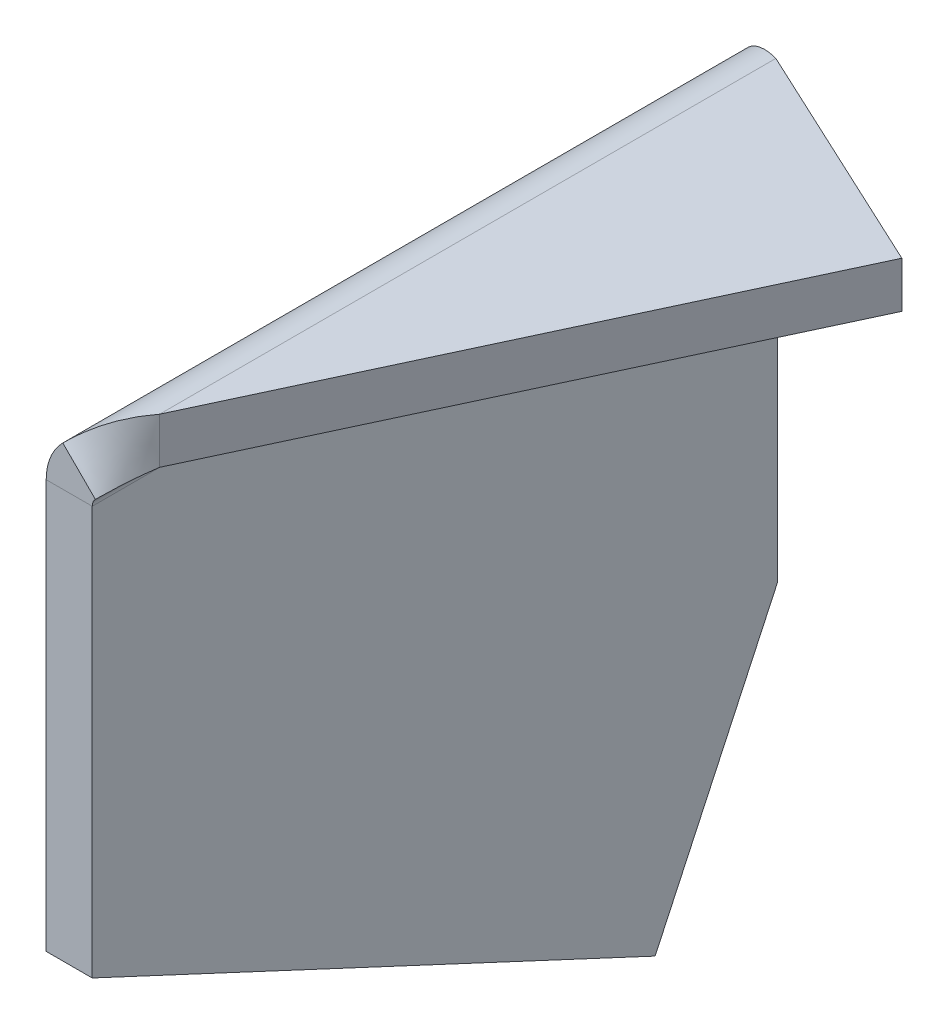
ISO-10303-21;
HEADER;
FILE_DESCRIPTION(('STEP AP214'),'2;1');
FILE_NAME('part.step','',(''),(''),'','','');
FILE_SCHEMA(('AUTOMOTIVE_DESIGN { 1 0 10303 214 1 1 1 1 }'));
ENDSEC;
DATA;
#1=APPLICATION_CONTEXT('core data for automotive mechanical design processes');
#2=APPLICATION_PROTOCOL_DEFINITION('international standard','automotive_design',2000,#1);
#3=PRODUCT_CONTEXT('',#1,'mechanical');
#4=PRODUCT('Part','Part','',(#3));
#5=PRODUCT_RELATED_PRODUCT_CATEGORY('part','',(#4));
#6=PRODUCT_DEFINITION_FORMATION('','',#4);
#7=PRODUCT_DEFINITION_CONTEXT('part definition',#1,'design');
#8=PRODUCT_DEFINITION('design','',#6,#7);
#9=PRODUCT_DEFINITION_SHAPE('','',#8);
#10=(LENGTH_UNIT() NAMED_UNIT(*) SI_UNIT(.MILLI.,.METRE.));
#11=(NAMED_UNIT(*) PLANE_ANGLE_UNIT() SI_UNIT($,.RADIAN.));
#12=(NAMED_UNIT(*) SI_UNIT($,.STERADIAN.) SOLID_ANGLE_UNIT());
#13=UNCERTAINTY_MEASURE_WITH_UNIT(LENGTH_MEASURE(1.E-05),#10,'distance_accuracy_value','');
#14=(GEOMETRIC_REPRESENTATION_CONTEXT(3) GLOBAL_UNCERTAINTY_ASSIGNED_CONTEXT((#13)) GLOBAL_UNIT_ASSIGNED_CONTEXT((#10,
#11,#12)) REPRESENTATION_CONTEXT('',''));
#15=CARTESIAN_POINT('',(0.,0.,0.));
#16=DIRECTION('',(0.,0.,1.));
#17=DIRECTION('',(1.,0.,0.));
#18=AXIS2_PLACEMENT_3D('',#15,#16,#17);
#19=CARTESIAN_POINT('',(31.0887438715521,-32.086256128448,0.));
#20=DIRECTION('',(-1.,0.,0.));
#21=DIRECTION('',(0.,0.,1.));
#22=AXIS2_PLACEMENT_3D('',#19,#20,#21);
#23=PLANE('',#22);
#24=DIRECTION('',(0.,-1.,0.));
#25=VECTOR('',#24,1.);
#26=CARTESIAN_POINT('',(31.088743871552,-2.08625612844799,0.));
#27=LINE('',#26,#25);
#28=CARTESIAN_POINT('',(31.088743871552,-3.9116,0.));
#29=VERTEX_POINT('',#28);
#30=CARTESIAN_POINT('',(31.0887438715521,-32.086256128448,0.));
#31=VERTEX_POINT('',#30);
#32=EDGE_CURVE('E61',#29,#31,#27,.T.);
#33=ORIENTED_EDGE('',*,*,#32,.F.);
#34=DIRECTION('',(0.,0.,1.));
#35=VECTOR('',#34,1.);
#36=CARTESIAN_POINT('',(31.088743871552,-3.9116,0.));
#37=LINE('',#36,#35);
#38=CARTESIAN_POINT('',(31.088743871552,-3.9116,47.26));
#39=VERTEX_POINT('',#38);
#40=EDGE_CURVE('E177',#29,#39,#37,.T.);
#41=ORIENTED_EDGE('',*,*,#40,.T.);
#42=DIRECTION('',(0.,1.,0.));
#43=VECTOR('',#42,1.);
#44=CARTESIAN_POINT('',(31.0887438715521,-32.086256128448,47.26));
#45=LINE('',#44,#43);
#46=CARTESIAN_POINT('',(31.0887438715521,-32.086256128448,47.26));
#47=VERTEX_POINT('',#46);
#48=EDGE_CURVE('E364',#47,#39,#45,.T.);
#49=ORIENTED_EDGE('',*,*,#48,.F.);
#50=DIRECTION('',(0.,0.4226182617407,0.90630778703665));
#51=VECTOR('',#50,1.);
#52=CARTESIAN_POINT('',(31.0887438715521,-32.086256128448,47.26));
#53=LINE('',#52,#51);
#54=CARTESIAN_POINT('',(31.0887438715522,-50.1878863193495,8.4409287831071));
#55=VERTEX_POINT('',#54);
#56=EDGE_CURVE('E362',#55,#47,#53,.T.);
#57=ORIENTED_EDGE('',*,*,#56,.F.);
#58=DIRECTION('',(0.,-0.90630778703665,0.4226182617407));
#59=VECTOR('',#58,1.);
#60=CARTESIAN_POINT('',(31.0887438715522,-50.1878863193495,8.4409287831071));
#61=LINE('',#60,#59);
#62=EDGE_CURVE('E359',#31,#55,#61,.T.);
#63=ORIENTED_EDGE('',*,*,#62,.F.);
#64=EDGE_LOOP('',(#33,#41,#49,#57,#63));
#65=FACE_BOUND('',#64,.T.);
#66=ADVANCED_FACE('F57',(#65),#23,.F.);
#67=CARTESIAN_POINT('',(31.0887438715522,-50.1878863193495,8.4409287831071));
#68=DIRECTION('',(0.,-0.4226182617407,-0.90630778703665));
#69=DIRECTION('',(0.,-0.90630778703665,0.4226182617407));
#70=AXIS2_PLACEMENT_3D('',#67,#68,#69);
#71=PLANE('',#70);
#72=DIRECTION('',(0.,-0.90630778703665,0.4226182617407));
#73=VECTOR('',#72,1.);
#74=CARTESIAN_POINT('',(27.9137438715522,-50.1878863193495,8.4409287831071));
#75=LINE('',#74,#73);
#76=CARTESIAN_POINT('',(27.9137438715521,-32.086256128448,0.));
#77=VERTEX_POINT('',#76);
#78=CARTESIAN_POINT('',(27.9137438715522,-50.1878863193495,8.4409287831071));
#79=VERTEX_POINT('',#78);
#80=EDGE_CURVE('E365',#77,#79,#75,.T.);
#81=ORIENTED_EDGE('',*,*,#80,.F.);
#82=DIRECTION('',(-1.,0.,0.));
#83=VECTOR('',#82,1.);
#84=CARTESIAN_POINT('',(31.0887438715521,-32.086256128448,0.));
#85=LINE('',#84,#83);
#86=EDGE_CURVE('E371',#31,#77,#85,.T.);
#87=ORIENTED_EDGE('',*,*,#86,.F.);
#88=ORIENTED_EDGE('',*,*,#62,.T.);
#89=DIRECTION('',(-1.,0.,0.));
#90=VECTOR('',#89,1.);
#91=CARTESIAN_POINT('',(31.0887438715522,-50.1878863193495,8.4409287831071));
#92=LINE('',#91,#90);
#93=EDGE_CURVE('E105',#55,#79,#92,.T.);
#94=ORIENTED_EDGE('',*,*,#93,.T.);
#95=EDGE_LOOP('',(#81,#87,#88,#94));
#96=FACE_BOUND('',#95,.T.);
#97=ADVANCED_FACE('F421',(#96),#71,.T.);
#98=CARTESIAN_POINT('',(31.088743871552,-2.08625612844799,0.));
#99=DIRECTION('',(0.,0.,-1.));
#100=DIRECTION('',(0.,-1.,0.));
#101=AXIS2_PLACEMENT_3D('',#98,#99,#100);
#102=PLANE('',#101);
#103=DIRECTION('',(-1.,0.,0.));
#104=VECTOR('',#103,1.);
#105=CARTESIAN_POINT('',(31.088743871552,-3.9116,0.));
#106=LINE('',#105,#104);
#107=CARTESIAN_POINT('',(27.913743871552,-3.91160000000001,0.));
#108=VERTEX_POINT('',#107);
#109=EDGE_CURVE('E377',#29,#108,#106,.T.);
#110=ORIENTED_EDGE('',*,*,#109,.F.);
#111=ORIENTED_EDGE('',*,*,#32,.T.);
#112=ORIENTED_EDGE('',*,*,#86,.T.);
#113=DIRECTION('',(0.,-1.,0.));
#114=VECTOR('',#113,1.);
#115=CARTESIAN_POINT('',(27.913743871552,-2.086256128448,0.));
#116=LINE('',#115,#114);
#117=EDGE_CURVE('E100',#108,#77,#116,.T.);
#118=ORIENTED_EDGE('',*,*,#117,.F.);
#119=EDGE_LOOP('',(#110,#111,#112,#118));
#120=FACE_BOUND('',#119,.T.);
#121=ADVANCED_FACE('F390',(#120),#102,.T.);
#122=CARTESIAN_POINT('',(31.0887438715521,-32.086256128448,47.26));
#123=DIRECTION('',(0.,0.,1.));
#124=DIRECTION('',(0.,1.,0.));
#125=AXIS2_PLACEMENT_3D('',#122,#123,#124);
#126=PLANE('',#125);
#127=DIRECTION('',(1.,0.,0.));
#128=VECTOR('',#127,1.);
#129=CARTESIAN_POINT('',(31.088743871552,-3.9116,47.26));
#130=LINE('',#129,#128);
#131=CARTESIAN_POINT('',(27.913743871552,-3.91160000000001,47.26));
#132=VERTEX_POINT('',#131);
#133=EDGE_CURVE('E12',#132,#39,#130,.T.);
#134=ORIENTED_EDGE('',*,*,#133,.F.);
#135=DIRECTION('',(0.,1.,0.));
#136=VECTOR('',#135,1.);
#137=CARTESIAN_POINT('',(27.9137438715521,-32.086256128448,47.26));
#138=LINE('',#137,#136);
#139=CARTESIAN_POINT('',(27.9137438715521,-32.086256128448,47.26));
#140=VERTEX_POINT('',#139);
#141=EDGE_CURVE('E370',#140,#132,#138,.T.);
#142=ORIENTED_EDGE('',*,*,#141,.F.);
#143=DIRECTION('',(-1.,0.,0.));
#144=VECTOR('',#143,1.);
#145=CARTESIAN_POINT('',(31.0887438715521,-32.086256128448,47.26));
#146=LINE('',#145,#144);
#147=EDGE_CURVE('E373',#47,#140,#146,.T.);
#148=ORIENTED_EDGE('',*,*,#147,.F.);
#149=ORIENTED_EDGE('',*,*,#48,.T.);
#150=EDGE_LOOP('',(#134,#142,#148,#149));
#151=FACE_BOUND('',#150,.T.);
#152=ADVANCED_FACE('F59',(#151),#126,.T.);
#153=CARTESIAN_POINT('',(31.0887438715521,-32.086256128448,47.26));
#154=DIRECTION('',(0.,-0.90630778703665,0.4226182617407));
#155=DIRECTION('',(0.,0.4226182617407,0.90630778703665));
#156=AXIS2_PLACEMENT_3D('',#153,#154,#155);
#157=PLANE('',#156);
#158=DIRECTION('',(0.,0.4226182617407,0.90630778703665));
#159=VECTOR('',#158,1.);
#160=CARTESIAN_POINT('',(27.9137438715521,-32.086256128448,47.26));
#161=LINE('',#160,#159);
#162=EDGE_CURVE('E367',#79,#140,#161,.T.);
#163=ORIENTED_EDGE('',*,*,#162,.F.);
#164=ORIENTED_EDGE('',*,*,#93,.F.);
#165=ORIENTED_EDGE('',*,*,#56,.T.);
#166=ORIENTED_EDGE('',*,*,#147,.T.);
#167=EDGE_LOOP('',(#163,#164,#165,#166));
#168=FACE_BOUND('',#167,.T.);
#169=ADVANCED_FACE('F345',(#168),#157,.T.);
#170=CARTESIAN_POINT('',(27.9137438715521,-32.086256128448,0.));
#171=DIRECTION('',(-1.,0.,0.));
#172=DIRECTION('',(0.,0.,1.));
#173=AXIS2_PLACEMENT_3D('',#170,#171,#172);
#174=PLANE('',#173);
#175=DIRECTION('',(0.,0.,1.));
#176=VECTOR('',#175,1.);
#177=CARTESIAN_POINT('',(27.913743871552,-3.91160000000001,0.));
#178=LINE('',#177,#176);
#179=EDGE_CURVE('E66',#108,#132,#178,.T.);
#180=ORIENTED_EDGE('',*,*,#179,.F.);
#181=ORIENTED_EDGE('',*,*,#117,.T.);
#182=ORIENTED_EDGE('',*,*,#80,.T.);
#183=ORIENTED_EDGE('',*,*,#162,.T.);
#184=ORIENTED_EDGE('',*,*,#141,.T.);
#185=EDGE_LOOP('',(#180,#181,#182,#183,#184));
#186=FACE_BOUND('',#185,.T.);
#187=ADVANCED_FACE('F385',(#186),#174,.T.);
#188=CARTESIAN_POINT('',(0.,-3.175,0.));
#189=DIRECTION('',(0.,1.,0.));
#190=DIRECTION('',(0.,0.,1.));
#191=AXIS2_PLACEMENT_3D('',#188,#189,#190);
#192=PLANE('',#191);
#193=DIRECTION('',(0.,0.,1.));
#194=VECTOR('',#193,1.);
#195=CARTESIAN_POINT('',(31.825343871552,-3.175,0.));
#196=LINE('',#195,#194);
#197=CARTESIAN_POINT('',(31.825343871552,-3.175,0.851171826071001));
#198=VERTEX_POINT('',#197);
#199=CARTESIAN_POINT('',(31.825343871552,-3.175,43.345537435147));
#200=VERTEX_POINT('',#199);
#201=EDGE_CURVE('E158',#198,#200,#196,.T.);
#202=ORIENTED_EDGE('',*,*,#201,.F.);
#203=DIRECTION('',(-0.90630778703665,0.,-0.4226182617407));
#204=VECTOR('',#203,1.);
#205=CARTESIAN_POINT('',(48.1016301909015,-3.175,8.4409287831071));
#206=LINE('',#205,#204);
#207=CARTESIAN_POINT('',(48.1016301909015,-3.175,8.4409287831071));
#208=VERTEX_POINT('',#207);
#209=EDGE_CURVE('E409',#208,#198,#206,.T.);
#210=ORIENTED_EDGE('',*,*,#209,.F.);
#211=DIRECTION('',(0.4226182617407,0.,-0.90630778703665));
#212=VECTOR('',#211,1.);
#213=CARTESIAN_POINT('',(30.,-3.175,47.26));
#214=LINE('',#213,#212);
#215=EDGE_CURVE('E297',#200,#208,#214,.T.);
#216=ORIENTED_EDGE('',*,*,#215,.F.);
#217=EDGE_LOOP('',(#202,#210,#216));
#218=FACE_BOUND('',#217,.T.);
#219=ADVANCED_FACE('F339',(#218),#192,.F.);
#220=CARTESIAN_POINT('',(48.1016301909015,-3.175,8.4409287831071));
#221=DIRECTION('',(0.4226182617407,0.,-0.90630778703665));
#222=DIRECTION('',(-0.90630778703665,0.,-0.4226182617407));
#223=AXIS2_PLACEMENT_3D('',#220,#221,#222);
#224=PLANE('',#223);
#225=ORIENTED_EDGE('',*,*,#209,.T.);
#226=CARTESIAN_POINT('',(31.825343871552,0.,0.851171826071001));
#227=CARTESIAN_POINT('',(31.825343871552,-3.175,0.851171826071001));
#228=B_SPLINE_CURVE_WITH_KNOTS('',1,(#226,#227),.UNSPECIFIED.,.F.,.F.,(2,2),(0.,1.),.UNSPECIFIED.);
#229=CARTESIAN_POINT('',(31.825343871552,0.,0.851171826070999));
#230=VERTEX_POINT('',#229);
#231=EDGE_CURVE('E167',#198,#230,#228,.F.);
#232=ORIENTED_EDGE('',*,*,#231,.T.);
#233=DIRECTION('',(-0.90630778703665,0.,-0.4226182617407));
#234=VECTOR('',#233,1.);
#235=CARTESIAN_POINT('',(48.1016301909015,0.,8.4409287831071));
#236=LINE('',#235,#234);
#237=CARTESIAN_POINT('',(48.1016301909015,0.,8.4409287831071));
#238=VERTEX_POINT('',#237);
#239=EDGE_CURVE('E311',#238,#230,#236,.T.);
#240=ORIENTED_EDGE('',*,*,#239,.F.);
#241=DIRECTION('',(0.,1.,0.));
#242=VECTOR('',#241,1.);
#243=CARTESIAN_POINT('',(48.1016301909015,-3.175,8.4409287831071));
#244=LINE('',#243,#242);
#245=EDGE_CURVE('E306',#208,#238,#244,.T.);
#246=ORIENTED_EDGE('',*,*,#245,.F.);
#247=EDGE_LOOP('',(#225,#232,#240,#246));
#248=FACE_BOUND('',#247,.T.);
#249=ADVANCED_FACE('F329',(#248),#224,.T.);
#250=CARTESIAN_POINT('',(0.,0.,0.));
#251=DIRECTION('',(0.,1.,0.));
#252=DIRECTION('',(0.,0.,1.));
#253=AXIS2_PLACEMENT_3D('',#250,#251,#252);
#254=PLANE('',#253);
#255=ORIENTED_EDGE('',*,*,#239,.T.);
#256=DIRECTION('',(0.,0.,1.));
#257=VECTOR('',#256,1.);
#258=CARTESIAN_POINT('',(31.825343871552,0.,0.));
#259=LINE('',#258,#257);
#260=CARTESIAN_POINT('',(31.825343871552,0.,43.345537435147));
#261=VERTEX_POINT('',#260);
#262=EDGE_CURVE('E300',#230,#261,#259,.T.);
#263=ORIENTED_EDGE('',*,*,#262,.T.);
#264=DIRECTION('',(0.4226182617407,0.,-0.90630778703665));
#265=VECTOR('',#264,1.);
#266=CARTESIAN_POINT('',(30.,0.,47.26));
#267=LINE('',#266,#265);
#268=EDGE_CURVE('E298',#261,#238,#267,.T.);
#269=ORIENTED_EDGE('',*,*,#268,.T.);
#270=EDGE_LOOP('',(#255,#263,#269));
#271=FACE_BOUND('',#270,.T.);
#272=ADVANCED_FACE('F310',(#271),#254,.T.);
#273=CARTESIAN_POINT('',(30.,-3.175,47.26));
#274=DIRECTION('',(0.90630778703665,0.,0.4226182617407));
#275=DIRECTION('',(0.4226182617407,0.,-0.90630778703665));
#276=AXIS2_PLACEMENT_3D('',#273,#274,#275);
#277=PLANE('',#276);
#278=ORIENTED_EDGE('',*,*,#268,.F.);
#279=CARTESIAN_POINT('',(31.825343871552,-3.175,43.345537435147));
#280=CARTESIAN_POINT('',(31.825343871552,0.,43.345537435147));
#281=B_SPLINE_CURVE_WITH_KNOTS('',1,(#279,#280),.UNSPECIFIED.,.F.,.F.,(2,2),(0.,1.),.UNSPECIFIED.);
#282=EDGE_CURVE('E278',#261,#200,#281,.F.);
#283=ORIENTED_EDGE('',*,*,#282,.T.);
#284=ORIENTED_EDGE('',*,*,#215,.T.);
#285=ORIENTED_EDGE('',*,*,#245,.T.);
#286=EDGE_LOOP('',(#278,#283,#284,#285));
#287=FACE_BOUND('',#286,.T.);
#288=ADVANCED_FACE('F304',(#287),#277,.T.);
#289=CARTESIAN_POINT('',(29.0594249862627,-1.14568111471071,0.));
#290=CARTESIAN_POINT('',(29.4215435461115,-0.783562554861925,0.141885724941602));
#291=CARTESIAN_POINT('',(29.8553878679332,-0.49369716331349,0.283723942023667));
#292=CARTESIAN_POINT('',(30.8014908470922,-0.101808477944218,0.567447884047334));
#293=CARTESIAN_POINT('',(31.3132308930268,0.,0.709286101129387));
#294=CARTESIAN_POINT('',(31.825343871552,0.,0.851171826071001));
#295=CARTESIAN_POINT('',(31.30448901653,-3.39074514497799,0.));
#296=CARTESIAN_POINT('',(31.3726726419507,-3.32256151955729,0.141870053163717));
#297=CARTESIAN_POINT('',(31.4543781306108,-3.26796894633825,0.283723942023667));
#298=CARTESIAN_POINT('',(31.632540379933,-3.19417172636612,0.567447884047334));
#299=CARTESIAN_POINT('',(31.7289176637503,-3.175,0.709301772907275));
#300=CARTESIAN_POINT('',(31.825343871552,-3.175,0.851171826071001));
#301=B_SPLINE_SURFACE_WITH_KNOTS('',1,3,((#289,#290,#291,#292,#293,#294),(#295,#296,#297,#298,
#299,#300)),.UNSPECIFIED.,.F.,.F.,.F.,(2,2),(4,2,4),(0.,1.),(0.,0.5,1.),.UNSPECIFIED.);
#302=CARTESIAN_POINT('',(31.30448901653,-3.39074514497799,0.));
#303=CARTESIAN_POINT('',(29.0594249862627,-1.14568111471071,0.));
#304=B_SPLINE_CURVE_WITH_KNOTS('',1,(#302,#303),.UNSPECIFIED.,.F.,.F.,(2,2),(0.,1.),.UNSPECIFIED.);
#305=CARTESIAN_POINT('',(29.0594249862627,-1.14568111471071,0.));
#306=VERTEX_POINT('',#305);
#307=CARTESIAN_POINT('',(31.30448901653,-3.39074514497799,0.));
#308=VERTEX_POINT('',#307);
#309=EDGE_CURVE('E147',#306,#308,#304,.F.);
#310=CARTESIAN_POINT('',(29.0594249862627,-1.14568111471071,0.));
#311=CARTESIAN_POINT('',(29.4215435461115,-0.783562554861925,0.141885724941602));
#312=CARTESIAN_POINT('',(29.8553878679332,-0.49369716331349,0.283723942023667));
#313=CARTESIAN_POINT('',(30.8014908470922,-0.101808477944218,0.567447884047334));
#314=CARTESIAN_POINT('',(31.3132308930268,0.,0.709286101129387));
#315=CARTESIAN_POINT('',(31.825343871552,0.,0.851171826071001));
#316=B_SPLINE_CURVE_WITH_KNOTS('',3,(#310,#311,#312,#313,#314,#315),.UNSPECIFIED.,.F.,.F.,(4,2,
4),(0.,0.5,1.),.UNSPECIFIED.);
#317=EDGE_CURVE('E187',#306,#230,#316,.T.);
#318=CARTESIAN_POINT('',(31.825343871552,-3.175,0.851171826071001));
#319=CARTESIAN_POINT('',(31.7289176637503,-3.175,0.709301772907275));
#320=CARTESIAN_POINT('',(31.632540379933,-3.19417172636612,0.567447884047334));
#321=CARTESIAN_POINT('',(31.4543781306108,-3.26796894633825,0.283723942023667));
#322=CARTESIAN_POINT('',(31.3726726419507,-3.32256151955729,0.141870053163717));
#323=CARTESIAN_POINT('',(31.30448901653,-3.39074514497799,0.));
#324=B_SPLINE_CURVE_WITH_KNOTS('',3,(#318,#319,#320,#321,#322,#323),.UNSPECIFIED.,.F.,.F.,(4,2,
4),(0.,0.5,1.),.UNSPECIFIED.);
#325=EDGE_CURVE('E163',#308,#198,#324,.F.);
#326=ORIENTED_EDGE('',*,*,#309,.F.);
#327=ORIENTED_EDGE('',*,*,#317,.T.);
#328=ORIENTED_EDGE('',*,*,#231,.F.);
#329=ORIENTED_EDGE('',*,*,#325,.F.);
#330=EDGE_LOOP('',(#326,#327,#328,#329));
#331=FACE_BOUND('',#330,.T.);
#332=ADVANCED_FACE('F165',(#331),#301,.F.);
#333=CARTESIAN_POINT('',(31.825343871552,0.,43.345537435147));
#334=CARTESIAN_POINT('',(31.3132814405293,0.,43.9979926986282));
#335=CARTESIAN_POINT('',(30.8014908470922,-0.101808477944218,44.650358290098));
#336=CARTESIAN_POINT('',(29.8553878679332,-0.493697163313491,45.955179145049));
#337=CARTESIAN_POINT('',(29.4215078036297,-0.783598297343675,46.6075447365189));
#338=CARTESIAN_POINT('',(29.0594249862627,-1.14568111471071,47.26));
#339=CARTESIAN_POINT('',(31.825343871552,-3.175,43.345537435147));
#340=CARTESIAN_POINT('',(31.7289227854266,-3.175,43.9979503769687));
#341=CARTESIAN_POINT('',(31.632540379933,-3.19417172636612,44.650358290098));
#342=CARTESIAN_POINT('',(31.4543781306108,-3.26796894633825,45.955179145049));
#343=CARTESIAN_POINT('',(31.3726690203787,-3.32256514112933,46.6075870581783));
#344=CARTESIAN_POINT('',(31.30448901653,-3.39074514497799,47.26));
#345=B_SPLINE_SURFACE_WITH_KNOTS('',1,3,((#333,#334,#335,#336,#337,#338),(#339,#340,#341,#342,
#343,#344)),.UNSPECIFIED.,.F.,.F.,.F.,(2,2),(4,2,4),(0.,1.),(0.,0.5,1.),.UNSPECIFIED.);
#346=CARTESIAN_POINT('',(31.825343871552,0.,43.345537435147));
#347=CARTESIAN_POINT('',(31.3132814405293,0.,43.9979926986282));
#348=CARTESIAN_POINT('',(30.8014908470922,-0.101808477944218,44.650358290098));
#349=CARTESIAN_POINT('',(29.8553878679332,-0.493697163313491,45.955179145049));
#350=CARTESIAN_POINT('',(29.4215078036297,-0.783598297343675,46.6075447365189));
#351=CARTESIAN_POINT('',(29.0594249862627,-1.14568111471071,47.26));
#352=B_SPLINE_CURVE_WITH_KNOTS('',3,(#346,#347,#348,#349,#350,#351),.UNSPECIFIED.,.F.,.F.,(4,2,
4),(0.,0.5,1.),.UNSPECIFIED.);
#353=CARTESIAN_POINT('',(29.0594249862627,-1.14568111471071,47.26));
#354=VERTEX_POINT('',#353);
#355=EDGE_CURVE('E293',#261,#354,#352,.T.);
#356=CARTESIAN_POINT('',(29.0594249862627,-1.14568111471071,47.26));
#357=CARTESIAN_POINT('',(31.30448901653,-3.39074514497799,47.26));
#358=B_SPLINE_CURVE_WITH_KNOTS('',1,(#356,#357),.UNSPECIFIED.,.F.,.F.,(2,2),(0.,1.),.UNSPECIFIED.);
#359=CARTESIAN_POINT('',(31.30448901653,-3.39074514497799,47.26));
#360=VERTEX_POINT('',#359);
#361=EDGE_CURVE('E159',#354,#360,#358,.T.);
#362=CARTESIAN_POINT('',(31.30448901653,-3.39074514497799,47.26));
#363=CARTESIAN_POINT('',(31.3726690203787,-3.32256514112933,46.6075870581783));
#364=CARTESIAN_POINT('',(31.4543781306108,-3.26796894633825,45.955179145049));
#365=CARTESIAN_POINT('',(31.632540379933,-3.19417172636612,44.650358290098));
#366=CARTESIAN_POINT('',(31.7289227854266,-3.175,43.9979503769687));
#367=CARTESIAN_POINT('',(31.825343871552,-3.175,43.345537435147));
#368=B_SPLINE_CURVE_WITH_KNOTS('',3,(#362,#363,#364,#365,#366,#367),.UNSPECIFIED.,.F.,.F.,(4,2,
4),(0.,0.5,1.),.UNSPECIFIED.);
#369=EDGE_CURVE('E172',#200,#360,#368,.F.);
#370=ORIENTED_EDGE('',*,*,#282,.F.);
#371=ORIENTED_EDGE('',*,*,#355,.T.);
#372=ORIENTED_EDGE('',*,*,#361,.T.);
#373=ORIENTED_EDGE('',*,*,#369,.F.);
#374=EDGE_LOOP('',(#370,#371,#372,#373));
#375=FACE_BOUND('',#374,.T.);
#376=ADVANCED_FACE('F228',(#375),#345,.F.);
#377=CARTESIAN_POINT('',(31.825343871552,-3.9116,47.26));
#378=DIRECTION('',(0.,0.,-1.));
#379=DIRECTION('',(-1.,0.,0.));
#380=AXIS2_PLACEMENT_3D('',#377,#378,#379);
#381=PLANE('',#380);
#382=ORIENTED_EDGE('',*,*,#361,.F.);
#383=CARTESIAN_POINT('',(31.825343871552,-3.9116,47.26));
#384=DIRECTION('',(0.,0.,-1.));
#385=DIRECTION('',(-1.,0.,0.));
#386=AXIS2_PLACEMENT_3D('',#383,#384,#385);
#387=CIRCLE('',#386,3.9116);
#388=EDGE_CURVE('E302',#354,#132,#387,.F.);
#389=ORIENTED_EDGE('',*,*,#388,.T.);
#390=ORIENTED_EDGE('',*,*,#133,.T.);
#391=CARTESIAN_POINT('',(31.825343871552,-3.9116,47.26));
#392=DIRECTION('',(0.,0.,1.));
#393=DIRECTION('',(-1.,0.,0.));
#394=AXIS2_PLACEMENT_3D('',#391,#392,#393);
#395=CIRCLE('',#394,0.7366);
#396=EDGE_CURVE('E74',#360,#39,#395,.T.);
#397=ORIENTED_EDGE('',*,*,#396,.F.);
#398=EDGE_LOOP('',(#382,#389,#390,#397));
#399=FACE_BOUND('',#398,.T.);
#400=ADVANCED_FACE('F203',(#399),#381,.F.);
#401=CARTESIAN_POINT('',(31.825343871552,-3.9116,0.));
#402=DIRECTION('',(0.,0.,1.));
#403=DIRECTION('',(1.,0.,0.));
#404=AXIS2_PLACEMENT_3D('',#401,#402,#403);
#405=PLANE('',#404);
#406=CARTESIAN_POINT('',(31.825343871552,-3.9116,0.));
#407=DIRECTION('',(0.,0.,-1.));
#408=DIRECTION('',(-1.,0.,0.));
#409=AXIS2_PLACEMENT_3D('',#406,#407,#408);
#410=CIRCLE('',#409,3.9116);
#411=EDGE_CURVE('E154',#108,#306,#410,.T.);
#412=ORIENTED_EDGE('',*,*,#411,.T.);
#413=ORIENTED_EDGE('',*,*,#309,.T.);
#414=CARTESIAN_POINT('',(31.825343871552,-3.9116,0.));
#415=DIRECTION('',(0.,0.,-1.));
#416=DIRECTION('',(1.,0.,0.));
#417=AXIS2_PLACEMENT_3D('',#414,#415,#416);
#418=CIRCLE('',#417,0.7366);
#419=EDGE_CURVE('E152',#29,#308,#418,.T.);
#420=ORIENTED_EDGE('',*,*,#419,.F.);
#421=ORIENTED_EDGE('',*,*,#109,.T.);
#422=EDGE_LOOP('',(#412,#413,#420,#421));
#423=FACE_BOUND('',#422,.T.);
#424=ADVANCED_FACE('F150',(#423),#405,.F.);
#425=CARTESIAN_POINT('',(31.825343871552,-3.9116,69.6053619663447));
#426=DIRECTION('',(0.,0.,-1.));
#427=DIRECTION('',(-1.,0.,0.));
#428=AXIS2_PLACEMENT_3D('',#425,#426,#427);
#429=CYLINDRICAL_SURFACE('',#428,0.7366);
#430=ORIENTED_EDGE('',*,*,#40,.F.);
#431=ORIENTED_EDGE('',*,*,#419,.T.);
#432=ORIENTED_EDGE('',*,*,#325,.T.);
#433=ORIENTED_EDGE('',*,*,#201,.T.);
#434=ORIENTED_EDGE('',*,*,#369,.T.);
#435=ORIENTED_EDGE('',*,*,#396,.T.);
#436=EDGE_LOOP('',(#430,#431,#432,#433,#434,#435));
#437=FACE_BOUND('',#436,.T.);
#438=ADVANCED_FACE('F175',(#437),#429,.F.);
#439=CARTESIAN_POINT('',(31.825343871552,-3.9116,69.6053619663447));
#440=DIRECTION('',(0.,0.,-1.));
#441=DIRECTION('',(-1.,0.,0.));
#442=AXIS2_PLACEMENT_3D('',#439,#440,#441);
#443=CYLINDRICAL_SURFACE('',#442,3.9116);
#444=ORIENTED_EDGE('',*,*,#179,.T.);
#445=ORIENTED_EDGE('',*,*,#388,.F.);
#446=ORIENTED_EDGE('',*,*,#355,.F.);
#447=ORIENTED_EDGE('',*,*,#262,.F.);
#448=ORIENTED_EDGE('',*,*,#317,.F.);
#449=ORIENTED_EDGE('',*,*,#411,.F.);
#450=EDGE_LOOP('',(#444,#445,#446,#447,#448,#449));
#451=FACE_BOUND('',#450,.T.);
#452=ADVANCED_FACE('F192',(#451),#443,.T.);
#453=CLOSED_SHELL('',(#66,#97,#121,#152,#169,#187,#219,#249,#272,#288,#332,#376,#400,#424,#438,#452));
#454=MANIFOLD_SOLID_BREP('B2',#453);
#455=ADVANCED_BREP_SHAPE_REPRESENTATION('',(#18,#454),#14);
#456=SHAPE_DEFINITION_REPRESENTATION(#9,#455);
ENDSEC;
END-ISO-10303-21;
